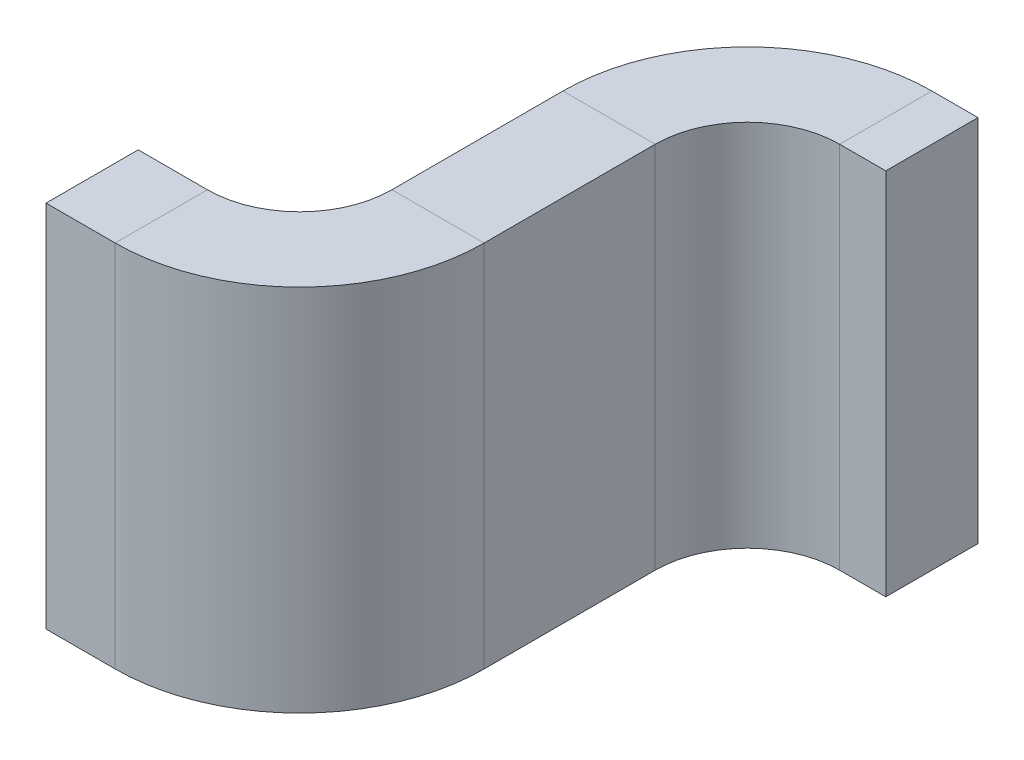
ISO-10303-21;
HEADER;
FILE_DESCRIPTION(('STEP AP214'),'2;1');
FILE_NAME('part.step','',(''),(''),'','','');
FILE_SCHEMA(('AUTOMOTIVE_DESIGN { 1 0 10303 214 1 1 1 1 }'));
ENDSEC;
DATA;
#1=APPLICATION_CONTEXT('core data for automotive mechanical design processes');
#2=APPLICATION_PROTOCOL_DEFINITION('international standard','automotive_design',2000,#1);
#3=PRODUCT_CONTEXT('',#1,'mechanical');
#4=PRODUCT('Part','Part','',(#3));
#5=PRODUCT_RELATED_PRODUCT_CATEGORY('part','',(#4));
#6=PRODUCT_DEFINITION_FORMATION('','',#4);
#7=PRODUCT_DEFINITION_CONTEXT('part definition',#1,'design');
#8=PRODUCT_DEFINITION('design','',#6,#7);
#9=PRODUCT_DEFINITION_SHAPE('','',#8);
#10=(LENGTH_UNIT() NAMED_UNIT(*) SI_UNIT(.MILLI.,.METRE.));
#11=(NAMED_UNIT(*) PLANE_ANGLE_UNIT() SI_UNIT($,.RADIAN.));
#12=(NAMED_UNIT(*) SI_UNIT($,.STERADIAN.) SOLID_ANGLE_UNIT());
#13=UNCERTAINTY_MEASURE_WITH_UNIT(LENGTH_MEASURE(1.E-05),#10,'distance_accuracy_value','');
#14=(GEOMETRIC_REPRESENTATION_CONTEXT(3) GLOBAL_UNCERTAINTY_ASSIGNED_CONTEXT((#13)) GLOBAL_UNIT_ASSIGNED_CONTEXT((#10,
#11,#12)) REPRESENTATION_CONTEXT('',''));
#15=CARTESIAN_POINT('',(0.,0.,0.));
#16=DIRECTION('',(0.,0.,1.));
#17=DIRECTION('',(1.,0.,0.));
#18=AXIS2_PLACEMENT_3D('',#15,#16,#17);
#19=CARTESIAN_POINT('',(0.,-0.2,0.4855));
#20=DIRECTION('',(-1.,0.,0.));
#21=DIRECTION('',(0.,0.,-1.));
#22=AXIS2_PLACEMENT_3D('',#19,#20,#21);
#23=PLANE('',#22);
#24=DIRECTION('',(0.,0.,1.));
#25=VECTOR('',#24,1.);
#26=CARTESIAN_POINT('',(0.,-0.2,0.5855));
#27=LINE('',#26,#25);
#28=CARTESIAN_POINT('',(0.,-0.2,0.4855));
#29=VERTEX_POINT('',#28);
#30=CARTESIAN_POINT('',(0.,-0.2,0.5855));
#31=VERTEX_POINT('',#30);
#32=EDGE_CURVE('E11',#29,#31,#27,.T.);
#33=ORIENTED_EDGE('',*,*,#32,.T.);
#34=DIRECTION('',(0.,1.,0.));
#35=VECTOR('',#34,1.);
#36=CARTESIAN_POINT('',(0.,0.2,0.5855));
#37=LINE('',#36,#35);
#38=CARTESIAN_POINT('',(0.,0.2,0.5855));
#39=VERTEX_POINT('',#38);
#40=EDGE_CURVE('E24',#31,#39,#37,.T.);
#41=ORIENTED_EDGE('',*,*,#40,.T.);
#42=DIRECTION('',(0.,0.,-1.));
#43=VECTOR('',#42,1.);
#44=CARTESIAN_POINT('',(0.,0.2,0.4855));
#45=LINE('',#44,#43);
#46=CARTESIAN_POINT('',(0.,0.2,0.4855));
#47=VERTEX_POINT('',#46);
#48=EDGE_CURVE('E217',#39,#47,#45,.T.);
#49=ORIENTED_EDGE('',*,*,#48,.T.);
#50=DIRECTION('',(0.,-1.,0.));
#51=VECTOR('',#50,1.);
#52=CARTESIAN_POINT('',(0.,-0.2,0.4855));
#53=LINE('',#52,#51);
#54=EDGE_CURVE('E36',#47,#29,#53,.T.);
#55=ORIENTED_EDGE('',*,*,#54,.T.);
#56=EDGE_LOOP('',(#33,#41,#49,#55));
#57=FACE_BOUND('',#56,.T.);
#58=ADVANCED_FACE('F17',(#57),#23,.T.);
#59=CARTESIAN_POINT('',(0.,-0.2,0.4855));
#60=DIRECTION('',(0.,0.,1.));
#61=DIRECTION('',(0.,-1.,0.));
#62=AXIS2_PLACEMENT_3D('',#59,#60,#61);
#63=PLANE('',#62);
#64=DIRECTION('',(0.,-1.,0.));
#65=VECTOR('',#64,1.);
#66=CARTESIAN_POINT('',(0.075,-0.2,0.4855));
#67=LINE('',#66,#65);
#68=CARTESIAN_POINT('',(0.075,0.2,0.4855));
#69=VERTEX_POINT('',#68);
#70=CARTESIAN_POINT('',(0.075,-0.2,0.4855));
#71=VERTEX_POINT('',#70);
#72=EDGE_CURVE('E213',#69,#71,#67,.T.);
#73=ORIENTED_EDGE('',*,*,#72,.T.);
#74=DIRECTION('',(1.,0.,0.));
#75=VECTOR('',#74,1.);
#76=CARTESIAN_POINT('',(0.,-0.2,0.4855));
#77=LINE('',#76,#75);
#78=EDGE_CURVE('E211',#29,#71,#77,.T.);
#79=ORIENTED_EDGE('',*,*,#78,.F.);
#80=ORIENTED_EDGE('',*,*,#54,.F.);
#81=DIRECTION('',(1.,0.,0.));
#82=VECTOR('',#81,1.);
#83=CARTESIAN_POINT('',(0.,0.2,0.4855));
#84=LINE('',#83,#82);
#85=EDGE_CURVE('E209',#47,#69,#84,.T.);
#86=ORIENTED_EDGE('',*,*,#85,.T.);
#87=EDGE_LOOP('',(#73,#79,#80,#86));
#88=FACE_BOUND('',#87,.T.);
#89=ADVANCED_FACE('F228',(#88),#63,.F.);
#90=CARTESIAN_POINT('',(0.075,-0.2,0.3855));
#91=DIRECTION('',(0.,1.,0.));
#92=DIRECTION('',(0.,0.,-1.));
#93=AXIS2_PLACEMENT_3D('',#90,#91,#92);
#94=CYLINDRICAL_SURFACE('',#93,0.1);
#95=DIRECTION('',(0.,1.,0.));
#96=VECTOR('',#95,1.);
#97=CARTESIAN_POINT('',(0.175,-0.2,0.3855));
#98=LINE('',#97,#96);
#99=CARTESIAN_POINT('',(0.175,-0.2,0.3855));
#100=VERTEX_POINT('',#99);
#101=CARTESIAN_POINT('',(0.175,0.2,0.3855));
#102=VERTEX_POINT('',#101);
#103=EDGE_CURVE('E206',#100,#102,#98,.T.);
#104=ORIENTED_EDGE('',*,*,#103,.F.);
#105=CARTESIAN_POINT('',(0.075,-0.2,0.3855));
#106=DIRECTION('',(0.,1.,0.));
#107=DIRECTION('',(0.,0.,-1.));
#108=AXIS2_PLACEMENT_3D('',#105,#106,#107);
#109=CIRCLE('',#108,0.1);
#110=EDGE_CURVE('E204',#71,#100,#109,.T.);
#111=ORIENTED_EDGE('',*,*,#110,.F.);
#112=ORIENTED_EDGE('',*,*,#72,.F.);
#113=CARTESIAN_POINT('',(0.075,0.2,0.3855));
#114=DIRECTION('',(0.,1.,0.));
#115=DIRECTION('',(0.,0.,-1.));
#116=AXIS2_PLACEMENT_3D('',#113,#114,#115);
#117=CIRCLE('',#116,0.1);
#118=EDGE_CURVE('E202',#69,#102,#117,.T.);
#119=ORIENTED_EDGE('',*,*,#118,.T.);
#120=EDGE_LOOP('',(#104,#111,#112,#119));
#121=FACE_BOUND('',#120,.T.);
#122=ADVANCED_FACE('F234',(#121),#94,.F.);
#123=CARTESIAN_POINT('',(0.175,-0.2,0.3855));
#124=DIRECTION('',(1.,0.,0.));
#125=DIRECTION('',(0.,-1.,0.));
#126=AXIS2_PLACEMENT_3D('',#123,#124,#125);
#127=PLANE('',#126);
#128=DIRECTION('',(0.,-1.,0.));
#129=VECTOR('',#128,1.);
#130=CARTESIAN_POINT('',(0.175,-0.2,0.2));
#131=LINE('',#130,#129);
#132=CARTESIAN_POINT('',(0.175,0.2,0.2));
#133=VERTEX_POINT('',#132);
#134=CARTESIAN_POINT('',(0.175,-0.2,0.2));
#135=VERTEX_POINT('',#134);
#136=EDGE_CURVE('E199',#133,#135,#131,.T.);
#137=ORIENTED_EDGE('',*,*,#136,.T.);
#138=DIRECTION('',(0.,0.,-1.));
#139=VECTOR('',#138,1.);
#140=CARTESIAN_POINT('',(0.175,-0.2,0.3855));
#141=LINE('',#140,#139);
#142=EDGE_CURVE('E197',#100,#135,#141,.T.);
#143=ORIENTED_EDGE('',*,*,#142,.F.);
#144=ORIENTED_EDGE('',*,*,#103,.T.);
#145=DIRECTION('',(0.,0.,-1.));
#146=VECTOR('',#145,1.);
#147=CARTESIAN_POINT('',(0.175,0.2,0.3855));
#148=LINE('',#147,#146);
#149=EDGE_CURVE('E195',#102,#133,#148,.T.);
#150=ORIENTED_EDGE('',*,*,#149,.T.);
#151=EDGE_LOOP('',(#137,#143,#144,#150));
#152=FACE_BOUND('',#151,.T.);
#153=ADVANCED_FACE('F246',(#152),#127,.F.);
#154=CARTESIAN_POINT('',(0.375,-0.2,0.2));
#155=DIRECTION('',(0.,-1.,0.));
#156=DIRECTION('',(0.,0.,-1.));
#157=AXIS2_PLACEMENT_3D('',#154,#155,#156);
#158=CYLINDRICAL_SURFACE('',#157,0.2);
#159=CARTESIAN_POINT('',(0.375,0.2,0.2));
#160=DIRECTION('',(0.,-1.,0.));
#161=DIRECTION('',(0.,0.,-1.));
#162=AXIS2_PLACEMENT_3D('',#159,#160,#161);
#163=CIRCLE('',#162,0.2);
#164=CARTESIAN_POINT('',(0.375,0.2,0.));
#165=VERTEX_POINT('',#164);
#166=EDGE_CURVE('E193',#133,#165,#163,.T.);
#167=ORIENTED_EDGE('',*,*,#166,.T.);
#168=DIRECTION('',(0.,-1.,0.));
#169=VECTOR('',#168,1.);
#170=CARTESIAN_POINT('',(0.375,-0.2,0.));
#171=LINE('',#170,#169);
#172=CARTESIAN_POINT('',(0.375,-0.2,0.));
#173=VERTEX_POINT('',#172);
#174=EDGE_CURVE('E191',#165,#173,#171,.T.);
#175=ORIENTED_EDGE('',*,*,#174,.T.);
#176=CARTESIAN_POINT('',(0.375,-0.2,0.2));
#177=DIRECTION('',(0.,-1.,0.));
#178=DIRECTION('',(0.,0.,-1.));
#179=AXIS2_PLACEMENT_3D('',#176,#177,#178);
#180=CIRCLE('',#179,0.2);
#181=EDGE_CURVE('E188',#135,#173,#180,.T.);
#182=ORIENTED_EDGE('',*,*,#181,.F.);
#183=ORIENTED_EDGE('',*,*,#136,.F.);
#184=EDGE_LOOP('',(#167,#175,#182,#183));
#185=FACE_BOUND('',#184,.T.);
#186=ADVANCED_FACE('F251',(#185),#158,.T.);
#187=CARTESIAN_POINT('',(0.375,-0.2,0.));
#188=DIRECTION('',(0.,0.,1.));
#189=DIRECTION('',(0.,-1.,0.));
#190=AXIS2_PLACEMENT_3D('',#187,#188,#189);
#191=PLANE('',#190);
#192=DIRECTION('',(0.,-1.,0.));
#193=VECTOR('',#192,1.);
#194=CARTESIAN_POINT('',(0.425,-0.2,0.));
#195=LINE('',#194,#193);
#196=CARTESIAN_POINT('',(0.425,0.2,0.));
#197=VERTEX_POINT('',#196);
#198=CARTESIAN_POINT('',(0.425,-0.2,0.));
#199=VERTEX_POINT('',#198);
#200=EDGE_CURVE('E130',#197,#199,#195,.T.);
#201=ORIENTED_EDGE('',*,*,#200,.T.);
#202=DIRECTION('',(1.,0.,0.));
#203=VECTOR('',#202,1.);
#204=CARTESIAN_POINT('',(0.375,-0.2,0.));
#205=LINE('',#204,#203);
#206=EDGE_CURVE('E185',#173,#199,#205,.T.);
#207=ORIENTED_EDGE('',*,*,#206,.F.);
#208=ORIENTED_EDGE('',*,*,#174,.F.);
#209=DIRECTION('',(1.,0.,0.));
#210=VECTOR('',#209,1.);
#211=CARTESIAN_POINT('',(0.375,0.2,0.));
#212=LINE('',#211,#210);
#213=EDGE_CURVE('E183',#165,#197,#212,.T.);
#214=ORIENTED_EDGE('',*,*,#213,.T.);
#215=EDGE_LOOP('',(#201,#207,#208,#214));
#216=FACE_BOUND('',#215,.T.);
#217=ADVANCED_FACE('F268',(#216),#191,.F.);
#218=CARTESIAN_POINT('',(0.,-0.2,0.5855));
#219=DIRECTION('',(0.,1.,0.));
#220=DIRECTION('',(0.,0.,1.));
#221=AXIS2_PLACEMENT_3D('',#218,#219,#220);
#222=PLANE('',#221);
#223=DIRECTION('',(0.,0.,1.));
#224=VECTOR('',#223,1.);
#225=CARTESIAN_POINT('',(0.075,-0.2,0.5855));
#226=LINE('',#225,#224);
#227=CARTESIAN_POINT('',(0.075,-0.2,0.5855));
#228=VERTEX_POINT('',#227);
#229=EDGE_CURVE('E180',#71,#228,#226,.T.);
#230=ORIENTED_EDGE('',*,*,#229,.T.);
#231=DIRECTION('',(1.,0.,0.));
#232=VECTOR('',#231,1.);
#233=CARTESIAN_POINT('',(0.,-0.2,0.5855));
#234=LINE('',#233,#232);
#235=EDGE_CURVE('E178',#31,#228,#234,.T.);
#236=ORIENTED_EDGE('',*,*,#235,.F.);
#237=ORIENTED_EDGE('',*,*,#32,.F.);
#238=ORIENTED_EDGE('',*,*,#78,.T.);
#239=EDGE_LOOP('',(#230,#236,#237,#238));
#240=FACE_BOUND('',#239,.T.);
#241=ADVANCED_FACE('F306',(#240),#222,.F.);
#242=CARTESIAN_POINT('',(0.181066017178,-0.2,0.491566017178));
#243=DIRECTION('',(0.,-1.,0.));
#244=DIRECTION('',(0.707106781186548,0.,-0.707106781186548));
#245=AXIS2_PLACEMENT_3D('',#242,#243,#244);
#246=PLANE('',#245);
#247=ORIENTED_EDGE('',*,*,#110,.T.);
#248=DIRECTION('',(1.,0.,0.));
#249=VECTOR('',#248,1.);
#250=CARTESIAN_POINT('',(0.275,-0.2,0.3855));
#251=LINE('',#250,#249);
#252=CARTESIAN_POINT('',(0.275,-0.2,0.3855));
#253=VERTEX_POINT('',#252);
#254=EDGE_CURVE('E176',#100,#253,#251,.T.);
#255=ORIENTED_EDGE('',*,*,#254,.T.);
#256=CARTESIAN_POINT('',(0.075,-0.2,0.3855));
#257=DIRECTION('',(0.,1.,0.));
#258=DIRECTION('',(0.,0.,-1.));
#259=AXIS2_PLACEMENT_3D('',#256,#257,#258);
#260=CIRCLE('',#259,0.2);
#261=EDGE_CURVE('E173',#228,#253,#260,.T.);
#262=ORIENTED_EDGE('',*,*,#261,.F.);
#263=ORIENTED_EDGE('',*,*,#229,.F.);
#264=EDGE_LOOP('',(#247,#255,#262,#263));
#265=FACE_BOUND('',#264,.T.);
#266=ADVANCED_FACE('F277',(#265),#246,.T.);
#267=CARTESIAN_POINT('',(0.275,-0.2,0.3855));
#268=DIRECTION('',(0.,1.,0.));
#269=DIRECTION('',(1.,0.,0.));
#270=AXIS2_PLACEMENT_3D('',#267,#268,#269);
#271=PLANE('',#270);
#272=DIRECTION('',(1.,0.,0.));
#273=VECTOR('',#272,1.);
#274=CARTESIAN_POINT('',(0.275,-0.2,0.2));
#275=LINE('',#274,#273);
#276=CARTESIAN_POINT('',(0.275,-0.2,0.2));
#277=VERTEX_POINT('',#276);
#278=EDGE_CURVE('E170',#135,#277,#275,.T.);
#279=ORIENTED_EDGE('',*,*,#278,.T.);
#280=DIRECTION('',(0.,0.,-1.));
#281=VECTOR('',#280,1.);
#282=CARTESIAN_POINT('',(0.275,-0.2,0.3855));
#283=LINE('',#282,#281);
#284=EDGE_CURVE('E168',#253,#277,#283,.T.);
#285=ORIENTED_EDGE('',*,*,#284,.F.);
#286=ORIENTED_EDGE('',*,*,#254,.F.);
#287=ORIENTED_EDGE('',*,*,#142,.T.);
#288=EDGE_LOOP('',(#279,#285,#286,#287));
#289=FACE_BOUND('',#288,.T.);
#290=ADVANCED_FACE('F272',(#289),#271,.F.);
#291=CARTESIAN_POINT('',(0.268933982822,-0.2,0.09393398282202));
#292=DIRECTION('',(0.,-1.,0.));
#293=DIRECTION('',(0.707106781186548,0.,-0.707106781186548));
#294=AXIS2_PLACEMENT_3D('',#291,#292,#293);
#295=PLANE('',#294);
#296=ORIENTED_EDGE('',*,*,#181,.T.);
#297=DIRECTION('',(0.,0.,1.));
#298=VECTOR('',#297,1.);
#299=CARTESIAN_POINT('',(0.375,-0.2,0.1));
#300=LINE('',#299,#298);
#301=CARTESIAN_POINT('',(0.375,-0.2,0.1));
#302=VERTEX_POINT('',#301);
#303=EDGE_CURVE('E166',#173,#302,#300,.T.);
#304=ORIENTED_EDGE('',*,*,#303,.T.);
#305=CARTESIAN_POINT('',(0.375,-0.2,0.2));
#306=DIRECTION('',(0.,-1.,0.));
#307=DIRECTION('',(0.,0.,-1.));
#308=AXIS2_PLACEMENT_3D('',#305,#306,#307);
#309=CIRCLE('',#308,0.1);
#310=EDGE_CURVE('E163',#277,#302,#309,.T.);
#311=ORIENTED_EDGE('',*,*,#310,.F.);
#312=ORIENTED_EDGE('',*,*,#278,.F.);
#313=EDGE_LOOP('',(#296,#304,#311,#312));
#314=FACE_BOUND('',#313,.T.);
#315=ADVANCED_FACE('F269',(#314),#295,.T.);
#316=CARTESIAN_POINT('',(0.375,-0.2,0.1));
#317=DIRECTION('',(0.,1.,0.));
#318=DIRECTION('',(0.,0.,1.));
#319=AXIS2_PLACEMENT_3D('',#316,#317,#318);
#320=PLANE('',#319);
#321=DIRECTION('',(0.,0.,1.));
#322=VECTOR('',#321,1.);
#323=CARTESIAN_POINT('',(0.425,-0.2,0.1));
#324=LINE('',#323,#322);
#325=CARTESIAN_POINT('',(0.425,-0.2,0.1));
#326=VERTEX_POINT('',#325);
#327=EDGE_CURVE('E161',#199,#326,#324,.T.);
#328=ORIENTED_EDGE('',*,*,#327,.T.);
#329=DIRECTION('',(1.,0.,0.));
#330=VECTOR('',#329,1.);
#331=CARTESIAN_POINT('',(0.375,-0.2,0.1));
#332=LINE('',#331,#330);
#333=EDGE_CURVE('E121',#302,#326,#332,.T.);
#334=ORIENTED_EDGE('',*,*,#333,.F.);
#335=ORIENTED_EDGE('',*,*,#303,.F.);
#336=ORIENTED_EDGE('',*,*,#206,.T.);
#337=EDGE_LOOP('',(#328,#334,#335,#336));
#338=FACE_BOUND('',#337,.T.);
#339=ADVANCED_FACE('F265',(#338),#320,.F.);
#340=CARTESIAN_POINT('',(0.,0.2,0.5855));
#341=DIRECTION('',(0.,0.,-1.));
#342=DIRECTION('',(0.,1.,0.));
#343=AXIS2_PLACEMENT_3D('',#340,#341,#342);
#344=PLANE('',#343);
#345=DIRECTION('',(0.,1.,0.));
#346=VECTOR('',#345,1.);
#347=CARTESIAN_POINT('',(0.075,0.2,0.5855));
#348=LINE('',#347,#346);
#349=CARTESIAN_POINT('',(0.075,0.2,0.5855));
#350=VERTEX_POINT('',#349);
#351=EDGE_CURVE('E157',#228,#350,#348,.T.);
#352=ORIENTED_EDGE('',*,*,#351,.T.);
#353=DIRECTION('',(1.,0.,0.));
#354=VECTOR('',#353,1.);
#355=CARTESIAN_POINT('',(0.,0.2,0.5855));
#356=LINE('',#355,#354);
#357=EDGE_CURVE('E155',#39,#350,#356,.T.);
#358=ORIENTED_EDGE('',*,*,#357,.F.);
#359=ORIENTED_EDGE('',*,*,#40,.F.);
#360=ORIENTED_EDGE('',*,*,#235,.T.);
#361=EDGE_LOOP('',(#352,#358,#359,#360));
#362=FACE_BOUND('',#361,.T.);
#363=ADVANCED_FACE('F220',(#362),#344,.F.);
#364=CARTESIAN_POINT('',(0.075,0.2,0.3855));
#365=DIRECTION('',(0.,1.,0.));
#366=DIRECTION('',(0.,0.,-1.));
#367=AXIS2_PLACEMENT_3D('',#364,#365,#366);
#368=CYLINDRICAL_SURFACE('',#367,0.2);
#369=ORIENTED_EDGE('',*,*,#261,.T.);
#370=DIRECTION('',(0.,1.,0.));
#371=VECTOR('',#370,1.);
#372=CARTESIAN_POINT('',(0.275,0.2,0.3855));
#373=LINE('',#372,#371);
#374=CARTESIAN_POINT('',(0.275,0.2,0.3855));
#375=VERTEX_POINT('',#374);
#376=EDGE_CURVE('E153',#253,#375,#373,.T.);
#377=ORIENTED_EDGE('',*,*,#376,.T.);
#378=CARTESIAN_POINT('',(0.075,0.2,0.3855));
#379=DIRECTION('',(0.,1.,0.));
#380=DIRECTION('',(0.,0.,-1.));
#381=AXIS2_PLACEMENT_3D('',#378,#379,#380);
#382=CIRCLE('',#381,0.2);
#383=EDGE_CURVE('E150',#350,#375,#382,.T.);
#384=ORIENTED_EDGE('',*,*,#383,.F.);
#385=ORIENTED_EDGE('',*,*,#351,.F.);
#386=EDGE_LOOP('',(#369,#377,#384,#385));
#387=FACE_BOUND('',#386,.T.);
#388=ADVANCED_FACE('F279',(#387),#368,.T.);
#389=CARTESIAN_POINT('',(0.275,0.2,0.3855));
#390=DIRECTION('',(-1.,0.,0.));
#391=DIRECTION('',(0.,1.,0.));
#392=AXIS2_PLACEMENT_3D('',#389,#390,#391);
#393=PLANE('',#392);
#394=DIRECTION('',(0.,1.,0.));
#395=VECTOR('',#394,1.);
#396=CARTESIAN_POINT('',(0.275,0.2,0.2));
#397=LINE('',#396,#395);
#398=CARTESIAN_POINT('',(0.275,0.2,0.2));
#399=VERTEX_POINT('',#398);
#400=EDGE_CURVE('E147',#277,#399,#397,.T.);
#401=ORIENTED_EDGE('',*,*,#400,.T.);
#402=DIRECTION('',(0.,0.,-1.));
#403=VECTOR('',#402,1.);
#404=CARTESIAN_POINT('',(0.275,0.2,0.3855));
#405=LINE('',#404,#403);
#406=EDGE_CURVE('E145',#375,#399,#405,.T.);
#407=ORIENTED_EDGE('',*,*,#406,.F.);
#408=ORIENTED_EDGE('',*,*,#376,.F.);
#409=ORIENTED_EDGE('',*,*,#284,.T.);
#410=EDGE_LOOP('',(#401,#407,#408,#409));
#411=FACE_BOUND('',#410,.T.);
#412=ADVANCED_FACE('F281',(#411),#393,.F.);
#413=CARTESIAN_POINT('',(0.375,0.2,0.2));
#414=DIRECTION('',(0.,-1.,0.));
#415=DIRECTION('',(0.,0.,-1.));
#416=AXIS2_PLACEMENT_3D('',#413,#414,#415);
#417=CYLINDRICAL_SURFACE('',#416,0.1);
#418=DIRECTION('',(0.,-1.,0.));
#419=VECTOR('',#418,1.);
#420=CARTESIAN_POINT('',(0.375,0.2,0.1));
#421=LINE('',#420,#419);
#422=CARTESIAN_POINT('',(0.375,0.2,0.1));
#423=VERTEX_POINT('',#422);
#424=EDGE_CURVE('E143',#423,#302,#421,.T.);
#425=ORIENTED_EDGE('',*,*,#424,.F.);
#426=CARTESIAN_POINT('',(0.375,0.2,0.2));
#427=DIRECTION('',(0.,-1.,0.));
#428=DIRECTION('',(0.,0.,-1.));
#429=AXIS2_PLACEMENT_3D('',#426,#427,#428);
#430=CIRCLE('',#429,0.1);
#431=EDGE_CURVE('E125',#399,#423,#430,.T.);
#432=ORIENTED_EDGE('',*,*,#431,.F.);
#433=ORIENTED_EDGE('',*,*,#400,.F.);
#434=ORIENTED_EDGE('',*,*,#310,.T.);
#435=EDGE_LOOP('',(#425,#432,#433,#434));
#436=FACE_BOUND('',#435,.T.);
#437=ADVANCED_FACE('F260',(#436),#417,.F.);
#438=CARTESIAN_POINT('',(0.375,0.2,0.1));
#439=DIRECTION('',(0.,0.,-1.));
#440=DIRECTION('',(0.,1.,0.));
#441=AXIS2_PLACEMENT_3D('',#438,#439,#440);
#442=PLANE('',#441);
#443=DIRECTION('',(0.,1.,0.));
#444=VECTOR('',#443,1.);
#445=CARTESIAN_POINT('',(0.425,0.2,0.1));
#446=LINE('',#445,#444);
#447=CARTESIAN_POINT('',(0.425,0.2,0.1));
#448=VERTEX_POINT('',#447);
#449=EDGE_CURVE('E115',#326,#448,#446,.T.);
#450=ORIENTED_EDGE('',*,*,#449,.T.);
#451=DIRECTION('',(1.,0.,0.));
#452=VECTOR('',#451,1.);
#453=CARTESIAN_POINT('',(0.375,0.2,0.1));
#454=LINE('',#453,#452);
#455=EDGE_CURVE('E105',#423,#448,#454,.T.);
#456=ORIENTED_EDGE('',*,*,#455,.F.);
#457=ORIENTED_EDGE('',*,*,#424,.T.);
#458=ORIENTED_EDGE('',*,*,#333,.T.);
#459=EDGE_LOOP('',(#450,#456,#457,#458));
#460=FACE_BOUND('',#459,.T.);
#461=ADVANCED_FACE('F119',(#460),#442,.F.);
#462=CARTESIAN_POINT('',(0.,0.2,0.4855));
#463=DIRECTION('',(0.,-1.,0.));
#464=DIRECTION('',(0.,0.,-1.));
#465=AXIS2_PLACEMENT_3D('',#462,#463,#464);
#466=PLANE('',#465);
#467=DIRECTION('',(0.,0.,-1.));
#468=VECTOR('',#467,1.);
#469=CARTESIAN_POINT('',(0.075,0.2,0.4855));
#470=LINE('',#469,#468);
#471=EDGE_CURVE('E116',#350,#69,#470,.T.);
#472=ORIENTED_EDGE('',*,*,#471,.T.);
#473=ORIENTED_EDGE('',*,*,#85,.F.);
#474=ORIENTED_EDGE('',*,*,#48,.F.);
#475=ORIENTED_EDGE('',*,*,#357,.T.);
#476=EDGE_LOOP('',(#472,#473,#474,#475));
#477=FACE_BOUND('',#476,.T.);
#478=ADVANCED_FACE('F224',(#477),#466,.F.);
#479=CARTESIAN_POINT('',(0.181066017178,0.2,0.491566017178));
#480=DIRECTION('',(0.,1.,0.));
#481=DIRECTION('',(0.707106781186548,0.,-0.707106781186548));
#482=AXIS2_PLACEMENT_3D('',#479,#480,#481);
#483=PLANE('',#482);
#484=ORIENTED_EDGE('',*,*,#383,.T.);
#485=DIRECTION('',(-1.,0.,0.));
#486=VECTOR('',#485,1.);
#487=CARTESIAN_POINT('',(0.175,0.2,0.3855));
#488=LINE('',#487,#486);
#489=EDGE_CURVE('E137',#375,#102,#488,.T.);
#490=ORIENTED_EDGE('',*,*,#489,.T.);
#491=ORIENTED_EDGE('',*,*,#118,.F.);
#492=ORIENTED_EDGE('',*,*,#471,.F.);
#493=EDGE_LOOP('',(#484,#490,#491,#492));
#494=FACE_BOUND('',#493,.T.);
#495=ADVANCED_FACE('F237',(#494),#483,.T.);
#496=CARTESIAN_POINT('',(0.175,0.2,0.3855));
#497=DIRECTION('',(0.,-1.,0.));
#498=DIRECTION('',(-1.,0.,0.));
#499=AXIS2_PLACEMENT_3D('',#496,#497,#498);
#500=PLANE('',#499);
#501=DIRECTION('',(-1.,0.,0.));
#502=VECTOR('',#501,1.);
#503=CARTESIAN_POINT('',(0.175,0.2,0.2));
#504=LINE('',#503,#502);
#505=EDGE_CURVE('E132',#399,#133,#504,.T.);
#506=ORIENTED_EDGE('',*,*,#505,.T.);
#507=ORIENTED_EDGE('',*,*,#149,.F.);
#508=ORIENTED_EDGE('',*,*,#489,.F.);
#509=ORIENTED_EDGE('',*,*,#406,.T.);
#510=EDGE_LOOP('',(#506,#507,#508,#509));
#511=FACE_BOUND('',#510,.T.);
#512=ADVANCED_FACE('F242',(#511),#500,.F.);
#513=CARTESIAN_POINT('',(0.268933982822,0.2,0.09393398282202));
#514=DIRECTION('',(0.,1.,0.));
#515=DIRECTION('',(0.707106781186548,0.,-0.707106781186548));
#516=AXIS2_PLACEMENT_3D('',#513,#514,#515);
#517=PLANE('',#516);
#518=ORIENTED_EDGE('',*,*,#431,.T.);
#519=DIRECTION('',(0.,0.,-1.));
#520=VECTOR('',#519,1.);
#521=CARTESIAN_POINT('',(0.375,0.2,0.));
#522=LINE('',#521,#520);
#523=EDGE_CURVE('E112',#423,#165,#522,.T.);
#524=ORIENTED_EDGE('',*,*,#523,.T.);
#525=ORIENTED_EDGE('',*,*,#166,.F.);
#526=ORIENTED_EDGE('',*,*,#505,.F.);
#527=EDGE_LOOP('',(#518,#524,#525,#526));
#528=FACE_BOUND('',#527,.T.);
#529=ADVANCED_FACE('F255',(#528),#517,.T.);
#530=CARTESIAN_POINT('',(0.375,0.2,0.));
#531=DIRECTION('',(0.,-1.,0.));
#532=DIRECTION('',(0.,0.,-1.));
#533=AXIS2_PLACEMENT_3D('',#530,#531,#532);
#534=PLANE('',#533);
#535=DIRECTION('',(0.,0.,-1.));
#536=VECTOR('',#535,1.);
#537=CARTESIAN_POINT('',(0.425,0.2,0.));
#538=LINE('',#537,#536);
#539=EDGE_CURVE('E110',#448,#197,#538,.T.);
#540=ORIENTED_EDGE('',*,*,#539,.T.);
#541=ORIENTED_EDGE('',*,*,#213,.F.);
#542=ORIENTED_EDGE('',*,*,#523,.F.);
#543=ORIENTED_EDGE('',*,*,#455,.T.);
#544=EDGE_LOOP('',(#540,#541,#542,#543));
#545=FACE_BOUND('',#544,.T.);
#546=ADVANCED_FACE('F107',(#545),#534,.F.);
#547=CARTESIAN_POINT('',(0.425,-0.2,0.));
#548=DIRECTION('',(-1.,0.,0.));
#549=DIRECTION('',(0.,0.,-1.));
#550=AXIS2_PLACEMENT_3D('',#547,#548,#549);
#551=PLANE('',#550);
#552=ORIENTED_EDGE('',*,*,#200,.F.);
#553=ORIENTED_EDGE('',*,*,#539,.F.);
#554=ORIENTED_EDGE('',*,*,#449,.F.);
#555=ORIENTED_EDGE('',*,*,#327,.F.);
#556=EDGE_LOOP('',(#552,#553,#554,#555));
#557=FACE_BOUND('',#556,.T.);
#558=ADVANCED_FACE('F128',(#557),#551,.F.);
#559=CLOSED_SHELL('',(#58,#89,#122,#153,#186,#217,#241,#266,#290,#315,#339,#363,#388,#412,#437,
#461,#478,#495,#512,#529,#546,#558));
#560=MANIFOLD_SOLID_BREP('B1',#559);
#561=ADVANCED_BREP_SHAPE_REPRESENTATION('',(#18,#560),#14);
#562=SHAPE_DEFINITION_REPRESENTATION(#9,#561);
ENDSEC;
END-ISO-10303-21;
